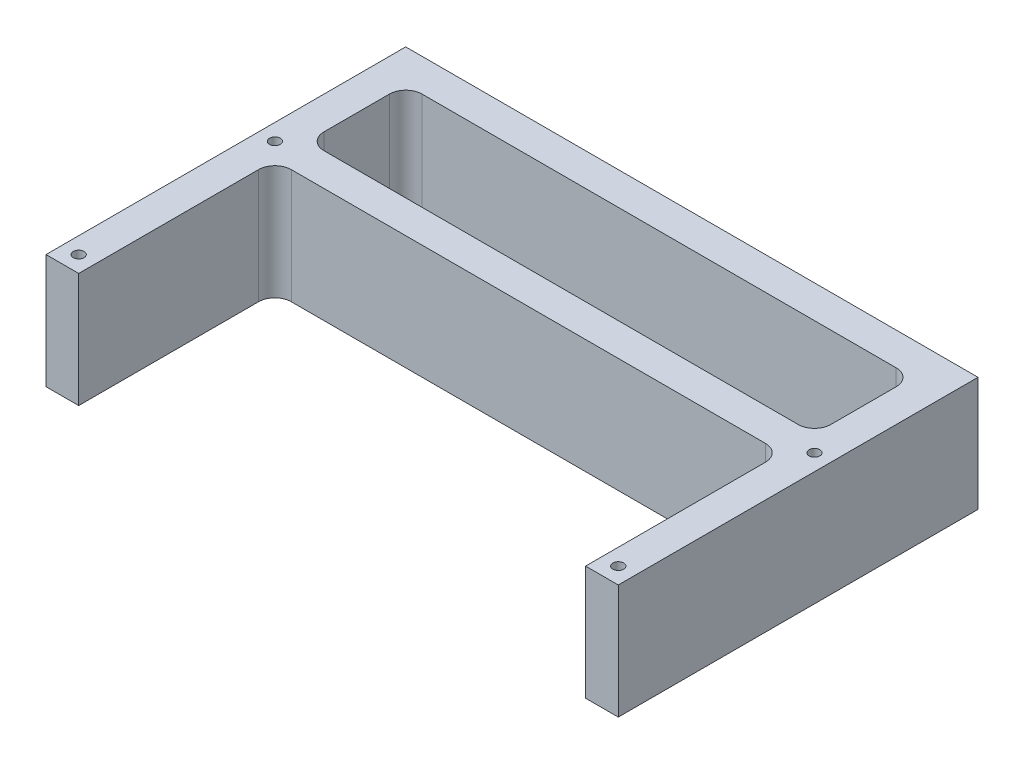
ISO-10303-21;
HEADER;
FILE_DESCRIPTION(('STEP AP214'),'2;1');
FILE_NAME('part.step','',(''),(''),'','','');
FILE_SCHEMA(('AUTOMOTIVE_DESIGN { 1 0 10303 214 1 1 1 1 }'));
ENDSEC;
DATA;
#1=APPLICATION_CONTEXT('core data for automotive mechanical design processes');
#2=APPLICATION_PROTOCOL_DEFINITION('international standard','automotive_design',2000,#1);
#3=PRODUCT_CONTEXT('',#1,'mechanical');
#4=PRODUCT('Part','Part','',(#3));
#5=PRODUCT_RELATED_PRODUCT_CATEGORY('part','',(#4));
#6=PRODUCT_DEFINITION_FORMATION('','',#4);
#7=PRODUCT_DEFINITION_CONTEXT('part definition',#1,'design');
#8=PRODUCT_DEFINITION('design','',#6,#7);
#9=PRODUCT_DEFINITION_SHAPE('','',#8);
#10=(LENGTH_UNIT() NAMED_UNIT(*) SI_UNIT(.MILLI.,.METRE.));
#11=(NAMED_UNIT(*) PLANE_ANGLE_UNIT() SI_UNIT($,.RADIAN.));
#12=(NAMED_UNIT(*) SI_UNIT($,.STERADIAN.) SOLID_ANGLE_UNIT());
#13=UNCERTAINTY_MEASURE_WITH_UNIT(LENGTH_MEASURE(1.E-05),#10,'distance_accuracy_value','');
#14=(GEOMETRIC_REPRESENTATION_CONTEXT(3) GLOBAL_UNCERTAINTY_ASSIGNED_CONTEXT((#13)) GLOBAL_UNIT_ASSIGNED_CONTEXT((#10,
#11,#12)) REPRESENTATION_CONTEXT('',''));
#15=CARTESIAN_POINT('',(0.,0.,0.));
#16=DIRECTION('',(0.,0.,1.));
#17=DIRECTION('',(1.,0.,0.));
#18=AXIS2_PLACEMENT_3D('',#15,#16,#17);
#19=CARTESIAN_POINT('',(0.,-17.5,0.));
#20=DIRECTION('',(0.,1.,0.));
#21=DIRECTION('',(0.,0.,1.));
#22=AXIS2_PLACEMENT_3D('',#19,#20,#21);
#23=PLANE('',#22);
#24=CARTESIAN_POINT('',(-82.5,-17.5,80.));
#25=DIRECTION('',(0.,-1.,0.));
#26=DIRECTION('',(0.,0.,-1.));
#27=AXIS2_PLACEMENT_3D('',#24,#25,#26);
#28=CIRCLE('',#27,1.64999999999998);
#29=CARTESIAN_POINT('',(-82.5,-17.5,78.35));
#30=VERTEX_POINT('',#29);
#31=EDGE_CURVE('E196',#30,#30,#28,.T.);
#32=ORIENTED_EDGE('',*,*,#31,.F.);
#33=EDGE_LOOP('',(#32));
#34=FACE_BOUND('',#33,.T.);
#35=DIRECTION('',(0.,0.,1.));
#36=VECTOR('',#35,1.);
#37=CARTESIAN_POINT('',(-87.5,-17.5,-25.));
#38=LINE('',#37,#36);
#39=CARTESIAN_POINT('',(-87.5,-17.5,-25.));
#40=VERTEX_POINT('',#39);
#41=CARTESIAN_POINT('',(-87.5,-17.5,85.));
#42=VERTEX_POINT('',#41);
#43=EDGE_CURVE('E268',#40,#42,#38,.T.);
#44=ORIENTED_EDGE('',*,*,#43,.F.);
#45=DIRECTION('',(-1.,0.,0.));
#46=VECTOR('',#45,1.);
#47=CARTESIAN_POINT('',(-87.5,-17.5,-25.));
#48=LINE('',#47,#46);
#49=CARTESIAN_POINT('',(87.5,-17.5,-25.));
#50=VERTEX_POINT('',#49);
#51=EDGE_CURVE('E286',#50,#40,#48,.T.);
#52=ORIENTED_EDGE('',*,*,#51,.F.);
#53=DIRECTION('',(0.,0.,-1.));
#54=VECTOR('',#53,1.);
#55=CARTESIAN_POINT('',(87.5,-17.5,25.));
#56=LINE('',#55,#54);
#57=CARTESIAN_POINT('',(87.5,-17.5,85.));
#58=VERTEX_POINT('',#57);
#59=EDGE_CURVE('E284',#58,#50,#56,.T.);
#60=ORIENTED_EDGE('',*,*,#59,.F.);
#61=DIRECTION('',(1.,0.,0.));
#62=VECTOR('',#61,1.);
#63=CARTESIAN_POINT('',(77.5,-17.5,85.));
#64=LINE('',#63,#62);
#65=CARTESIAN_POINT('',(77.5,-17.5,85.));
#66=VERTEX_POINT('',#65);
#67=EDGE_CURVE('E281',#66,#58,#64,.T.);
#68=ORIENTED_EDGE('',*,*,#67,.F.);
#69=DIRECTION('',(0.,0.,1.));
#70=VECTOR('',#69,1.);
#71=CARTESIAN_POINT('',(77.5,-17.5,25.));
#72=LINE('',#71,#70);
#73=CARTESIAN_POINT('',(77.5,-17.5,30.));
#74=VERTEX_POINT('',#73);
#75=EDGE_CURVE('E279',#74,#66,#72,.T.);
#76=ORIENTED_EDGE('',*,*,#75,.F.);
#77=CARTESIAN_POINT('',(72.5,-17.5,30.));
#78=DIRECTION('',(0.,1.,0.));
#79=DIRECTION('',(0.,0.,1.));
#80=AXIS2_PLACEMENT_3D('',#77,#78,#79);
#81=CIRCLE('',#80,5.);
#82=CARTESIAN_POINT('',(72.5,-17.5,25.));
#83=VERTEX_POINT('',#82);
#84=EDGE_CURVE('E360',#74,#83,#81,.T.);
#85=ORIENTED_EDGE('',*,*,#84,.T.);
#86=DIRECTION('',(1.,0.,0.));
#87=VECTOR('',#86,1.);
#88=CARTESIAN_POINT('',(-77.5,-17.5,25.));
#89=LINE('',#88,#87);
#90=CARTESIAN_POINT('',(-72.5,-17.5,25.));
#91=VERTEX_POINT('',#90);
#92=EDGE_CURVE('E276',#91,#83,#89,.T.);
#93=ORIENTED_EDGE('',*,*,#92,.F.);
#94=CARTESIAN_POINT('',(-72.5,-17.5,30.));
#95=DIRECTION('',(0.,1.,0.));
#96=DIRECTION('',(0.,0.,1.));
#97=AXIS2_PLACEMENT_3D('',#94,#95,#96);
#98=CIRCLE('',#97,5.);
#99=CARTESIAN_POINT('',(-77.5,-17.5,30.));
#100=VERTEX_POINT('',#99);
#101=EDGE_CURVE('E52',#91,#100,#98,.T.);
#102=ORIENTED_EDGE('',*,*,#101,.T.);
#103=DIRECTION('',(0.,0.,-1.));
#104=VECTOR('',#103,1.);
#105=CARTESIAN_POINT('',(-77.5,-17.5,25.));
#106=LINE('',#105,#104);
#107=CARTESIAN_POINT('',(-77.5,-17.5,85.));
#108=VERTEX_POINT('',#107);
#109=EDGE_CURVE('E274',#108,#100,#106,.T.);
#110=ORIENTED_EDGE('',*,*,#109,.F.);
#111=DIRECTION('',(1.,0.,0.));
#112=VECTOR('',#111,1.);
#113=CARTESIAN_POINT('',(-87.5,-17.5,85.));
#114=LINE('',#113,#112);
#115=EDGE_CURVE('E270',#42,#108,#114,.T.);
#116=ORIENTED_EDGE('',*,*,#115,.F.);
#117=EDGE_LOOP('',(#44,#52,#60,#68,#76,#85,#93,#102,#110,#116));
#118=FACE_BOUND('',#117,.T.);
#119=DIRECTION('',(0.,0.,-1.));
#120=VECTOR('',#119,1.);
#121=CARTESIAN_POINT('',(77.5,-17.5,-15.));
#122=LINE('',#121,#120);
#123=CARTESIAN_POINT('',(77.5,-17.5,10.));
#124=VERTEX_POINT('',#123);
#125=CARTESIAN_POINT('',(77.5,-17.5,-10.));
#126=VERTEX_POINT('',#125);
#127=EDGE_CURVE('E251',#124,#126,#122,.T.);
#128=ORIENTED_EDGE('',*,*,#127,.T.);
#129=CARTESIAN_POINT('',(72.5,-17.5,-10.));
#130=DIRECTION('',(0.,1.,0.));
#131=DIRECTION('',(0.,0.,1.));
#132=AXIS2_PLACEMENT_3D('',#129,#130,#131);
#133=CIRCLE('',#132,5.);
#134=CARTESIAN_POINT('',(72.5,-17.5,-15.));
#135=VERTEX_POINT('',#134);
#136=EDGE_CURVE('E364',#126,#135,#133,.T.);
#137=ORIENTED_EDGE('',*,*,#136,.T.);
#138=DIRECTION('',(-1.,0.,0.));
#139=VECTOR('',#138,1.);
#140=CARTESIAN_POINT('',(-77.5,-17.5,-15.));
#141=LINE('',#140,#139);
#142=CARTESIAN_POINT('',(-72.5,-17.5,-15.));
#143=VERTEX_POINT('',#142);
#144=EDGE_CURVE('E254',#135,#143,#141,.T.);
#145=ORIENTED_EDGE('',*,*,#144,.T.);
#146=CARTESIAN_POINT('',(-72.5,-17.5,-10.));
#147=DIRECTION('',(0.,1.,0.));
#148=DIRECTION('',(0.,0.,1.));
#149=AXIS2_PLACEMENT_3D('',#146,#147,#148);
#150=CIRCLE('',#149,5.);
#151=CARTESIAN_POINT('',(-77.5,-17.5,-10.));
#152=VERTEX_POINT('',#151);
#153=EDGE_CURVE('E11',#143,#152,#150,.T.);
#154=ORIENTED_EDGE('',*,*,#153,.T.);
#155=DIRECTION('',(0.,0.,1.));
#156=VECTOR('',#155,1.);
#157=CARTESIAN_POINT('',(-77.5,-17.5,-15.));
#158=LINE('',#157,#156);
#159=CARTESIAN_POINT('',(-77.5,-17.5,10.));
#160=VERTEX_POINT('',#159);
#161=EDGE_CURVE('E244',#152,#160,#158,.T.);
#162=ORIENTED_EDGE('',*,*,#161,.T.);
#163=CARTESIAN_POINT('',(-72.5,-17.5,10.));
#164=DIRECTION('',(0.,1.,0.));
#165=DIRECTION('',(0.,0.,1.));
#166=AXIS2_PLACEMENT_3D('',#163,#164,#165);
#167=CIRCLE('',#166,5.);
#168=CARTESIAN_POINT('',(-72.5,-17.5,15.));
#169=VERTEX_POINT('',#168);
#170=EDGE_CURVE('E368',#160,#169,#167,.T.);
#171=ORIENTED_EDGE('',*,*,#170,.T.);
#172=DIRECTION('',(1.,0.,0.));
#173=VECTOR('',#172,1.);
#174=CARTESIAN_POINT('',(-77.5,-17.5,15.));
#175=LINE('',#174,#173);
#176=CARTESIAN_POINT('',(72.5,-17.5,15.));
#177=VERTEX_POINT('',#176);
#178=EDGE_CURVE('E247',#169,#177,#175,.T.);
#179=ORIENTED_EDGE('',*,*,#178,.T.);
#180=CARTESIAN_POINT('',(72.5,-17.5,10.));
#181=DIRECTION('',(0.,1.,0.));
#182=DIRECTION('',(0.,0.,1.));
#183=AXIS2_PLACEMENT_3D('',#180,#181,#182);
#184=CIRCLE('',#183,5.);
#185=EDGE_CURVE('E356',#177,#124,#184,.T.);
#186=ORIENTED_EDGE('',*,*,#185,.T.);
#187=EDGE_LOOP('',(#128,#137,#145,#154,#162,#171,#179,#186));
#188=FACE_BOUND('',#187,.T.);
#189=CARTESIAN_POINT('',(82.5,-17.5,20.));
#190=DIRECTION('',(0.,-1.,0.));
#191=DIRECTION('',(0.,0.,-1.));
#192=AXIS2_PLACEMENT_3D('',#189,#190,#191);
#193=CIRCLE('',#192,1.64999999999998);
#194=CARTESIAN_POINT('',(82.5,-17.5,18.35));
#195=VERTEX_POINT('',#194);
#196=EDGE_CURVE('E213',#195,#195,#193,.T.);
#197=ORIENTED_EDGE('',*,*,#196,.F.);
#198=EDGE_LOOP('',(#197));
#199=FACE_BOUND('',#198,.T.);
#200=CARTESIAN_POINT('',(82.5,-17.5,80.));
#201=DIRECTION('',(0.,-1.,0.));
#202=DIRECTION('',(0.,0.,-1.));
#203=AXIS2_PLACEMENT_3D('',#200,#201,#202);
#204=CIRCLE('',#203,1.64999999999998);
#205=CARTESIAN_POINT('',(82.5,-17.5,78.35));
#206=VERTEX_POINT('',#205);
#207=EDGE_CURVE('E207',#206,#206,#204,.T.);
#208=ORIENTED_EDGE('',*,*,#207,.F.);
#209=EDGE_LOOP('',(#208));
#210=FACE_BOUND('',#209,.T.);
#211=CARTESIAN_POINT('',(-82.5,-17.5,20.));
#212=DIRECTION('',(0.,-1.,0.));
#213=DIRECTION('',(0.,0.,-1.));
#214=AXIS2_PLACEMENT_3D('',#211,#212,#213);
#215=CIRCLE('',#214,1.64999999999998);
#216=CARTESIAN_POINT('',(-82.5,-17.5,18.35));
#217=VERTEX_POINT('',#216);
#218=EDGE_CURVE('E197',#217,#217,#215,.T.);
#219=ORIENTED_EDGE('',*,*,#218,.F.);
#220=EDGE_LOOP('',(#219));
#221=FACE_BOUND('',#220,.T.);
#222=ADVANCED_FACE('F37',(#34,#118,#188,#199,#210,#221),#23,.F.);
#223=CARTESIAN_POINT('',(-87.5,-17.5,-25.));
#224=DIRECTION('',(0.,0.,-1.));
#225=DIRECTION('',(-1.,0.,0.));
#226=AXIS2_PLACEMENT_3D('',#223,#224,#225);
#227=PLANE('',#226);
#228=DIRECTION('',(-1.,0.,0.));
#229=VECTOR('',#228,1.);
#230=CARTESIAN_POINT('',(-87.5,17.5,-25.));
#231=LINE('',#230,#229);
#232=CARTESIAN_POINT('',(87.5,17.5,-25.));
#233=VERTEX_POINT('',#232);
#234=CARTESIAN_POINT('',(-87.5,17.5,-25.));
#235=VERTEX_POINT('',#234);
#236=EDGE_CURVE('E271',#233,#235,#231,.T.);
#237=ORIENTED_EDGE('',*,*,#236,.F.);
#238=DIRECTION('',(0.,1.,0.));
#239=VECTOR('',#238,1.);
#240=CARTESIAN_POINT('',(87.5,-17.5,-25.));
#241=LINE('',#240,#239);
#242=EDGE_CURVE('E315',#50,#233,#241,.T.);
#243=ORIENTED_EDGE('',*,*,#242,.F.);
#244=ORIENTED_EDGE('',*,*,#51,.T.);
#245=DIRECTION('',(0.,1.,0.));
#246=VECTOR('',#245,1.);
#247=CARTESIAN_POINT('',(-87.5,-17.5,-25.));
#248=LINE('',#247,#246);
#249=EDGE_CURVE('E311',#40,#235,#248,.T.);
#250=ORIENTED_EDGE('',*,*,#249,.T.);
#251=EDGE_LOOP('',(#237,#243,#244,#250));
#252=FACE_BOUND('',#251,.T.);
#253=ADVANCED_FACE('F423',(#252),#227,.T.);
#254=CARTESIAN_POINT('',(87.5,-17.5,-25.));
#255=DIRECTION('',(1.,0.,0.));
#256=DIRECTION('',(0.,0.,-1.));
#257=AXIS2_PLACEMENT_3D('',#254,#255,#256);
#258=PLANE('',#257);
#259=DIRECTION('',(0.,0.,-1.));
#260=VECTOR('',#259,1.);
#261=CARTESIAN_POINT('',(87.5,17.5,-25.));
#262=LINE('',#261,#260);
#263=CARTESIAN_POINT('',(87.5,17.5,85.));
#264=VERTEX_POINT('',#263);
#265=EDGE_CURVE('E306',#264,#233,#262,.T.);
#266=ORIENTED_EDGE('',*,*,#265,.F.);
#267=DIRECTION('',(0.,1.,0.));
#268=VECTOR('',#267,1.);
#269=CARTESIAN_POINT('',(87.5,-17.5,85.));
#270=LINE('',#269,#268);
#271=EDGE_CURVE('E317',#58,#264,#270,.T.);
#272=ORIENTED_EDGE('',*,*,#271,.F.);
#273=ORIENTED_EDGE('',*,*,#59,.T.);
#274=ORIENTED_EDGE('',*,*,#242,.T.);
#275=EDGE_LOOP('',(#266,#272,#273,#274));
#276=FACE_BOUND('',#275,.T.);
#277=ADVANCED_FACE('F429',(#276),#258,.T.);
#278=CARTESIAN_POINT('',(77.5,-17.5,85.));
#279=DIRECTION('',(0.,0.,1.));
#280=DIRECTION('',(1.,0.,0.));
#281=AXIS2_PLACEMENT_3D('',#278,#279,#280);
#282=PLANE('',#281);
#283=DIRECTION('',(1.,0.,0.));
#284=VECTOR('',#283,1.);
#285=CARTESIAN_POINT('',(77.5,17.5,85.));
#286=LINE('',#285,#284);
#287=CARTESIAN_POINT('',(77.5,17.5,85.));
#288=VERTEX_POINT('',#287);
#289=EDGE_CURVE('E303',#288,#264,#286,.T.);
#290=ORIENTED_EDGE('',*,*,#289,.F.);
#291=DIRECTION('',(0.,1.,0.));
#292=VECTOR('',#291,1.);
#293=CARTESIAN_POINT('',(77.5,-17.5,85.));
#294=LINE('',#293,#292);
#295=EDGE_CURVE('E320',#66,#288,#294,.T.);
#296=ORIENTED_EDGE('',*,*,#295,.F.);
#297=ORIENTED_EDGE('',*,*,#67,.T.);
#298=ORIENTED_EDGE('',*,*,#271,.T.);
#299=EDGE_LOOP('',(#290,#296,#297,#298));
#300=FACE_BOUND('',#299,.T.);
#301=ADVANCED_FACE('F442',(#300),#282,.T.);
#302=CARTESIAN_POINT('',(77.5,-17.5,25.));
#303=DIRECTION('',(-1.,0.,0.));
#304=DIRECTION('',(0.,0.,1.));
#305=AXIS2_PLACEMENT_3D('',#302,#303,#304);
#306=PLANE('',#305);
#307=DIRECTION('',(0.,0.,1.));
#308=VECTOR('',#307,1.);
#309=CARTESIAN_POINT('',(77.5,17.5,25.));
#310=LINE('',#309,#308);
#311=CARTESIAN_POINT('',(77.5,17.5,30.));
#312=VERTEX_POINT('',#311);
#313=EDGE_CURVE('E301',#312,#288,#310,.T.);
#314=ORIENTED_EDGE('',*,*,#313,.F.);
#315=DIRECTION('',(0.,1.,0.));
#316=VECTOR('',#315,1.);
#317=CARTESIAN_POINT('',(77.5,-17.5,30.));
#318=LINE('',#317,#316);
#319=EDGE_CURVE('E340',#312,#74,#318,.F.);
#320=ORIENTED_EDGE('',*,*,#319,.T.);
#321=ORIENTED_EDGE('',*,*,#75,.T.);
#322=ORIENTED_EDGE('',*,*,#295,.T.);
#323=EDGE_LOOP('',(#314,#320,#321,#322));
#324=FACE_BOUND('',#323,.T.);
#325=ADVANCED_FACE('F446',(#324),#306,.T.);
#326=CARTESIAN_POINT('',(-77.5,-17.5,25.));
#327=DIRECTION('',(0.,0.,1.));
#328=DIRECTION('',(1.,0.,0.));
#329=AXIS2_PLACEMENT_3D('',#326,#327,#328);
#330=PLANE('',#329);
#331=ORIENTED_EDGE('',*,*,#92,.T.);
#332=DIRECTION('',(0.,1.,0.));
#333=VECTOR('',#332,1.);
#334=CARTESIAN_POINT('',(72.5,17.5,25.));
#335=LINE('',#334,#333);
#336=CARTESIAN_POINT('',(72.5,17.5,25.));
#337=VERTEX_POINT('',#336);
#338=EDGE_CURVE('E337',#83,#337,#335,.T.);
#339=ORIENTED_EDGE('',*,*,#338,.T.);
#340=DIRECTION('',(1.,0.,0.));
#341=VECTOR('',#340,1.);
#342=CARTESIAN_POINT('',(-77.5,17.5,25.));
#343=LINE('',#342,#341);
#344=CARTESIAN_POINT('',(-72.5,17.5,25.));
#345=VERTEX_POINT('',#344);
#346=EDGE_CURVE('E298',#345,#337,#343,.T.);
#347=ORIENTED_EDGE('',*,*,#346,.F.);
#348=DIRECTION('',(0.,1.,0.));
#349=VECTOR('',#348,1.);
#350=CARTESIAN_POINT('',(-72.5,-17.5,25.));
#351=LINE('',#350,#349);
#352=EDGE_CURVE('E335',#345,#91,#351,.F.);
#353=ORIENTED_EDGE('',*,*,#352,.T.);
#354=EDGE_LOOP('',(#331,#339,#347,#353));
#355=FACE_BOUND('',#354,.T.);
#356=ADVANCED_FACE('F450',(#355),#330,.T.);
#357=CARTESIAN_POINT('',(-77.5,-17.5,25.));
#358=DIRECTION('',(1.,0.,0.));
#359=DIRECTION('',(0.,0.,-1.));
#360=AXIS2_PLACEMENT_3D('',#357,#358,#359);
#361=PLANE('',#360);
#362=ORIENTED_EDGE('',*,*,#109,.T.);
#363=DIRECTION('',(0.,1.,0.));
#364=VECTOR('',#363,1.);
#365=CARTESIAN_POINT('',(-77.5,17.5,30.));
#366=LINE('',#365,#364);
#367=CARTESIAN_POINT('',(-77.5,17.5,30.));
#368=VERTEX_POINT('',#367);
#369=EDGE_CURVE('E352',#100,#368,#366,.T.);
#370=ORIENTED_EDGE('',*,*,#369,.T.);
#371=DIRECTION('',(0.,0.,-1.));
#372=VECTOR('',#371,1.);
#373=CARTESIAN_POINT('',(-77.5,17.5,25.));
#374=LINE('',#373,#372);
#375=CARTESIAN_POINT('',(-77.5,17.5,85.));
#376=VERTEX_POINT('',#375);
#377=EDGE_CURVE('E295',#376,#368,#374,.T.);
#378=ORIENTED_EDGE('',*,*,#377,.F.);
#379=DIRECTION('',(0.,1.,0.));
#380=VECTOR('',#379,1.);
#381=CARTESIAN_POINT('',(-77.5,-17.5,85.));
#382=LINE('',#381,#380);
#383=EDGE_CURVE('E323',#108,#376,#382,.T.);
#384=ORIENTED_EDGE('',*,*,#383,.F.);
#385=EDGE_LOOP('',(#362,#370,#378,#384));
#386=FACE_BOUND('',#385,.T.);
#387=ADVANCED_FACE('F454',(#386),#361,.T.);
#388=CARTESIAN_POINT('',(-87.5,-17.5,85.));
#389=DIRECTION('',(0.,0.,1.));
#390=DIRECTION('',(1.,0.,0.));
#391=AXIS2_PLACEMENT_3D('',#388,#389,#390);
#392=PLANE('',#391);
#393=DIRECTION('',(1.,0.,0.));
#394=VECTOR('',#393,1.);
#395=CARTESIAN_POINT('',(-87.5,17.5,85.));
#396=LINE('',#395,#394);
#397=CARTESIAN_POINT('',(-87.5,17.5,85.));
#398=VERTEX_POINT('',#397);
#399=EDGE_CURVE('E292',#398,#376,#396,.T.);
#400=ORIENTED_EDGE('',*,*,#399,.F.);
#401=DIRECTION('',(0.,1.,0.));
#402=VECTOR('',#401,1.);
#403=CARTESIAN_POINT('',(-87.5,-17.5,85.));
#404=LINE('',#403,#402);
#405=EDGE_CURVE('E289',#42,#398,#404,.T.);
#406=ORIENTED_EDGE('',*,*,#405,.F.);
#407=ORIENTED_EDGE('',*,*,#115,.T.);
#408=ORIENTED_EDGE('',*,*,#383,.T.);
#409=EDGE_LOOP('',(#400,#406,#407,#408));
#410=FACE_BOUND('',#409,.T.);
#411=ADVANCED_FACE('F458',(#410),#392,.T.);
#412=CARTESIAN_POINT('',(-87.5,-17.5,25.));
#413=DIRECTION('',(-1.,0.,0.));
#414=DIRECTION('',(0.,0.,1.));
#415=AXIS2_PLACEMENT_3D('',#412,#413,#414);
#416=PLANE('',#415);
#417=DIRECTION('',(0.,0.,1.));
#418=VECTOR('',#417,1.);
#419=CARTESIAN_POINT('',(-87.5,17.5,25.));
#420=LINE('',#419,#418);
#421=EDGE_CURVE('E257',#235,#398,#420,.T.);
#422=ORIENTED_EDGE('',*,*,#421,.F.);
#423=ORIENTED_EDGE('',*,*,#249,.F.);
#424=ORIENTED_EDGE('',*,*,#43,.T.);
#425=ORIENTED_EDGE('',*,*,#405,.T.);
#426=EDGE_LOOP('',(#422,#423,#424,#425));
#427=FACE_BOUND('',#426,.T.);
#428=ADVANCED_FACE('F437',(#427),#416,.T.);
#429=CARTESIAN_POINT('',(0.,17.5,0.));
#430=DIRECTION('',(0.,1.,0.));
#431=DIRECTION('',(0.,0.,1.));
#432=AXIS2_PLACEMENT_3D('',#429,#430,#431);
#433=PLANE('',#432);
#434=CARTESIAN_POINT('',(-82.5,17.5,20.));
#435=DIRECTION('',(0.,1.,0.));
#436=DIRECTION('',(0.,0.,1.));
#437=AXIS2_PLACEMENT_3D('',#434,#435,#436);
#438=CIRCLE('',#437,1.64999999999998);
#439=CARTESIAN_POINT('',(-82.5,17.5,21.65));
#440=VERTEX_POINT('',#439);
#441=EDGE_CURVE('E219',#440,#440,#438,.T.);
#442=ORIENTED_EDGE('',*,*,#441,.F.);
#443=EDGE_LOOP('',(#442));
#444=FACE_BOUND('',#443,.T.);
#445=CARTESIAN_POINT('',(-82.5,17.5,80.));
#446=DIRECTION('',(0.,1.,0.));
#447=DIRECTION('',(0.,0.,1.));
#448=AXIS2_PLACEMENT_3D('',#445,#446,#447);
#449=CIRCLE('',#448,1.64999999999998);
#450=CARTESIAN_POINT('',(-82.5,17.5,81.65));
#451=VERTEX_POINT('',#450);
#452=EDGE_CURVE('E225',#451,#451,#449,.T.);
#453=ORIENTED_EDGE('',*,*,#452,.F.);
#454=EDGE_LOOP('',(#453));
#455=FACE_BOUND('',#454,.T.);
#456=CARTESIAN_POINT('',(82.5,17.5,80.));
#457=DIRECTION('',(0.,1.,0.));
#458=DIRECTION('',(0.,0.,1.));
#459=AXIS2_PLACEMENT_3D('',#456,#457,#458);
#460=CIRCLE('',#459,1.64999999999998);
#461=CARTESIAN_POINT('',(82.5,17.5,81.65));
#462=VERTEX_POINT('',#461);
#463=EDGE_CURVE('E231',#462,#462,#460,.T.);
#464=ORIENTED_EDGE('',*,*,#463,.F.);
#465=EDGE_LOOP('',(#464));
#466=FACE_BOUND('',#465,.T.);
#467=CARTESIAN_POINT('',(82.5,17.5,20.));
#468=DIRECTION('',(0.,1.,0.));
#469=DIRECTION('',(0.,0.,1.));
#470=AXIS2_PLACEMENT_3D('',#467,#468,#469);
#471=CIRCLE('',#470,1.64999999999998);
#472=CARTESIAN_POINT('',(82.5,17.5,21.65));
#473=VERTEX_POINT('',#472);
#474=EDGE_CURVE('E237',#473,#473,#471,.T.);
#475=ORIENTED_EDGE('',*,*,#474,.F.);
#476=EDGE_LOOP('',(#475));
#477=FACE_BOUND('',#476,.T.);
#478=DIRECTION('',(0.,0.,1.));
#479=VECTOR('',#478,1.);
#480=CARTESIAN_POINT('',(-77.5,17.5,-15.));
#481=LINE('',#480,#479);
#482=CARTESIAN_POINT('',(-77.5,17.5,-10.));
#483=VERTEX_POINT('',#482);
#484=CARTESIAN_POINT('',(-77.5,17.5,10.));
#485=VERTEX_POINT('',#484);
#486=EDGE_CURVE('E243',#483,#485,#481,.T.);
#487=ORIENTED_EDGE('',*,*,#486,.F.);
#488=CARTESIAN_POINT('',(-72.5,17.5,-10.));
#489=DIRECTION('',(0.,1.,0.));
#490=DIRECTION('',(0.,0.,1.));
#491=AXIS2_PLACEMENT_3D('',#488,#489,#490);
#492=CIRCLE('',#491,5.);
#493=CARTESIAN_POINT('',(-72.5,17.5,-15.));
#494=VERTEX_POINT('',#493);
#495=EDGE_CURVE('E45',#483,#494,#492,.F.);
#496=ORIENTED_EDGE('',*,*,#495,.T.);
#497=DIRECTION('',(-1.,0.,0.));
#498=VECTOR('',#497,1.);
#499=CARTESIAN_POINT('',(-77.5,17.5,-15.));
#500=LINE('',#499,#498);
#501=CARTESIAN_POINT('',(72.5,17.5,-15.));
#502=VERTEX_POINT('',#501);
#503=EDGE_CURVE('E248',#502,#494,#500,.T.);
#504=ORIENTED_EDGE('',*,*,#503,.F.);
#505=CARTESIAN_POINT('',(72.5,17.5,-10.));
#506=DIRECTION('',(0.,1.,0.));
#507=DIRECTION('',(0.,0.,1.));
#508=AXIS2_PLACEMENT_3D('',#505,#506,#507);
#509=CIRCLE('',#508,5.);
#510=CARTESIAN_POINT('',(77.5,17.5,-10.));
#511=VERTEX_POINT('',#510);
#512=EDGE_CURVE('E362',#502,#511,#509,.F.);
#513=ORIENTED_EDGE('',*,*,#512,.T.);
#514=DIRECTION('',(0.,0.,-1.));
#515=VECTOR('',#514,1.);
#516=CARTESIAN_POINT('',(77.5,17.5,-15.));
#517=LINE('',#516,#515);
#518=CARTESIAN_POINT('',(77.5,17.5,10.));
#519=VERTEX_POINT('',#518);
#520=EDGE_CURVE('E263',#519,#511,#517,.T.);
#521=ORIENTED_EDGE('',*,*,#520,.F.);
#522=CARTESIAN_POINT('',(72.5,17.5,10.));
#523=DIRECTION('',(0.,1.,0.));
#524=DIRECTION('',(0.,0.,1.));
#525=AXIS2_PLACEMENT_3D('',#522,#523,#524);
#526=CIRCLE('',#525,5.);
#527=CARTESIAN_POINT('',(72.5,17.5,15.));
#528=VERTEX_POINT('',#527);
#529=EDGE_CURVE('E354',#519,#528,#526,.F.);
#530=ORIENTED_EDGE('',*,*,#529,.T.);
#531=DIRECTION('',(1.,0.,0.));
#532=VECTOR('',#531,1.);
#533=CARTESIAN_POINT('',(-77.5,17.5,15.));
#534=LINE('',#533,#532);
#535=CARTESIAN_POINT('',(-72.5,17.5,15.));
#536=VERTEX_POINT('',#535);
#537=EDGE_CURVE('E260',#536,#528,#534,.T.);
#538=ORIENTED_EDGE('',*,*,#537,.F.);
#539=CARTESIAN_POINT('',(-72.5,17.5,10.));
#540=DIRECTION('',(0.,1.,0.));
#541=DIRECTION('',(0.,0.,1.));
#542=AXIS2_PLACEMENT_3D('',#539,#540,#541);
#543=CIRCLE('',#542,5.);
#544=EDGE_CURVE('E366',#536,#485,#543,.F.);
#545=ORIENTED_EDGE('',*,*,#544,.T.);
#546=EDGE_LOOP('',(#487,#496,#504,#513,#521,#530,#538,#545));
#547=FACE_BOUND('',#546,.T.);
#548=ORIENTED_EDGE('',*,*,#236,.T.);
#549=ORIENTED_EDGE('',*,*,#421,.T.);
#550=ORIENTED_EDGE('',*,*,#399,.T.);
#551=ORIENTED_EDGE('',*,*,#377,.T.);
#552=CARTESIAN_POINT('',(-72.5,17.5,30.));
#553=DIRECTION('',(0.,1.,0.));
#554=DIRECTION('',(0.,0.,1.));
#555=AXIS2_PLACEMENT_3D('',#552,#553,#554);
#556=CIRCLE('',#555,5.);
#557=EDGE_CURVE('E60',#368,#345,#556,.F.);
#558=ORIENTED_EDGE('',*,*,#557,.T.);
#559=ORIENTED_EDGE('',*,*,#346,.T.);
#560=CARTESIAN_POINT('',(72.5,17.5,30.));
#561=DIRECTION('',(0.,1.,0.));
#562=DIRECTION('',(0.,0.,1.));
#563=AXIS2_PLACEMENT_3D('',#560,#561,#562);
#564=CIRCLE('',#563,5.);
#565=EDGE_CURVE('E358',#337,#312,#564,.F.);
#566=ORIENTED_EDGE('',*,*,#565,.T.);
#567=ORIENTED_EDGE('',*,*,#313,.T.);
#568=ORIENTED_EDGE('',*,*,#289,.T.);
#569=ORIENTED_EDGE('',*,*,#265,.T.);
#570=EDGE_LOOP('',(#548,#549,#550,#551,#558,#559,#566,#567,#568,#569));
#571=FACE_BOUND('',#570,.T.);
#572=ADVANCED_FACE('F374',(#444,#455,#466,#477,#547,#571),#433,.T.);
#573=CARTESIAN_POINT('',(-77.5,-17.5,-15.));
#574=DIRECTION('',(-1.,0.,0.));
#575=DIRECTION('',(0.,0.,1.));
#576=AXIS2_PLACEMENT_3D('',#573,#574,#575);
#577=PLANE('',#576);
#578=ORIENTED_EDGE('',*,*,#486,.T.);
#579=DIRECTION('',(0.,1.,0.));
#580=VECTOR('',#579,1.);
#581=CARTESIAN_POINT('',(-77.5,-17.5,10.));
#582=LINE('',#581,#580);
#583=EDGE_CURVE('E350',#485,#160,#582,.F.);
#584=ORIENTED_EDGE('',*,*,#583,.T.);
#585=ORIENTED_EDGE('',*,*,#161,.F.);
#586=DIRECTION('',(0.,1.,0.));
#587=VECTOR('',#586,1.);
#588=CARTESIAN_POINT('',(-77.5,17.5,-10.));
#589=LINE('',#588,#587);
#590=EDGE_CURVE('E347',#152,#483,#589,.T.);
#591=ORIENTED_EDGE('',*,*,#590,.T.);
#592=EDGE_LOOP('',(#578,#584,#585,#591));
#593=FACE_BOUND('',#592,.T.);
#594=ADVANCED_FACE('F389',(#593),#577,.F.);
#595=CARTESIAN_POINT('',(-77.5,-17.5,-15.));
#596=DIRECTION('',(0.,0.,-1.));
#597=DIRECTION('',(-1.,0.,0.));
#598=AXIS2_PLACEMENT_3D('',#595,#596,#597);
#599=PLANE('',#598);
#600=ORIENTED_EDGE('',*,*,#144,.F.);
#601=DIRECTION('',(0.,1.,0.));
#602=VECTOR('',#601,1.);
#603=CARTESIAN_POINT('',(72.5,17.5,-15.));
#604=LINE('',#603,#602);
#605=EDGE_CURVE('E344',#135,#502,#604,.T.);
#606=ORIENTED_EDGE('',*,*,#605,.T.);
#607=ORIENTED_EDGE('',*,*,#503,.T.);
#608=DIRECTION('',(0.,1.,0.));
#609=VECTOR('',#608,1.);
#610=CARTESIAN_POINT('',(-72.5,-17.5,-15.));
#611=LINE('',#610,#609);
#612=EDGE_CURVE('E342',#494,#143,#611,.F.);
#613=ORIENTED_EDGE('',*,*,#612,.T.);
#614=EDGE_LOOP('',(#600,#606,#607,#613));
#615=FACE_BOUND('',#614,.T.);
#616=ADVANCED_FACE('F381',(#615),#599,.F.);
#617=CARTESIAN_POINT('',(77.5,-17.5,-15.));
#618=DIRECTION('',(1.,0.,0.));
#619=DIRECTION('',(0.,0.,-1.));
#620=AXIS2_PLACEMENT_3D('',#617,#618,#619);
#621=PLANE('',#620);
#622=ORIENTED_EDGE('',*,*,#127,.F.);
#623=DIRECTION('',(0.,1.,0.));
#624=VECTOR('',#623,1.);
#625=CARTESIAN_POINT('',(77.5,17.5,10.));
#626=LINE('',#625,#624);
#627=EDGE_CURVE('E327',#124,#519,#626,.T.);
#628=ORIENTED_EDGE('',*,*,#627,.T.);
#629=ORIENTED_EDGE('',*,*,#520,.T.);
#630=DIRECTION('',(0.,1.,0.));
#631=VECTOR('',#630,1.);
#632=CARTESIAN_POINT('',(77.5,-17.5,-10.));
#633=LINE('',#632,#631);
#634=EDGE_CURVE('E314',#511,#126,#633,.F.);
#635=ORIENTED_EDGE('',*,*,#634,.T.);
#636=EDGE_LOOP('',(#622,#628,#629,#635));
#637=FACE_BOUND('',#636,.T.);
#638=ADVANCED_FACE('F406',(#637),#621,.F.);
#639=CARTESIAN_POINT('',(-77.5,-17.5,15.));
#640=DIRECTION('',(0.,0.,1.));
#641=DIRECTION('',(1.,0.,0.));
#642=AXIS2_PLACEMENT_3D('',#639,#640,#641);
#643=PLANE('',#642);
#644=ORIENTED_EDGE('',*,*,#537,.T.);
#645=DIRECTION('',(0.,1.,0.));
#646=VECTOR('',#645,1.);
#647=CARTESIAN_POINT('',(72.5,-17.5,15.));
#648=LINE('',#647,#646);
#649=EDGE_CURVE('E333',#528,#177,#648,.F.);
#650=ORIENTED_EDGE('',*,*,#649,.T.);
#651=ORIENTED_EDGE('',*,*,#178,.F.);
#652=DIRECTION('',(0.,1.,0.));
#653=VECTOR('',#652,1.);
#654=CARTESIAN_POINT('',(-72.5,17.5,15.));
#655=LINE('',#654,#653);
#656=EDGE_CURVE('E330',#169,#536,#655,.T.);
#657=ORIENTED_EDGE('',*,*,#656,.T.);
#658=EDGE_LOOP('',(#644,#650,#651,#657));
#659=FACE_BOUND('',#658,.T.);
#660=ADVANCED_FACE('F397',(#659),#643,.F.);
#661=CARTESIAN_POINT('',(72.5,-17.5,10.));
#662=DIRECTION('',(0.,-1.,0.));
#663=DIRECTION('',(0.,0.,-1.));
#664=AXIS2_PLACEMENT_3D('',#661,#662,#663);
#665=CYLINDRICAL_SURFACE('',#664,5.);
#666=ORIENTED_EDGE('',*,*,#185,.F.);
#667=ORIENTED_EDGE('',*,*,#649,.F.);
#668=ORIENTED_EDGE('',*,*,#529,.F.);
#669=ORIENTED_EDGE('',*,*,#627,.F.);
#670=EDGE_LOOP('',(#666,#667,#668,#669));
#671=FACE_BOUND('',#670,.T.);
#672=ADVANCED_FACE('F401',(#671),#665,.F.);
#673=CARTESIAN_POINT('',(72.5,-17.5,30.));
#674=DIRECTION('',(0.,-1.,0.));
#675=DIRECTION('',(0.,0.,-1.));
#676=AXIS2_PLACEMENT_3D('',#673,#674,#675);
#677=CYLINDRICAL_SURFACE('',#676,5.);
#678=ORIENTED_EDGE('',*,*,#84,.F.);
#679=ORIENTED_EDGE('',*,*,#319,.F.);
#680=ORIENTED_EDGE('',*,*,#565,.F.);
#681=ORIENTED_EDGE('',*,*,#338,.F.);
#682=EDGE_LOOP('',(#678,#679,#680,#681));
#683=FACE_BOUND('',#682,.T.);
#684=ADVANCED_FACE('F412',(#683),#677,.F.);
#685=CARTESIAN_POINT('',(72.5,-17.5,-10.));
#686=DIRECTION('',(0.,-1.,0.));
#687=DIRECTION('',(0.,0.,-1.));
#688=AXIS2_PLACEMENT_3D('',#685,#686,#687);
#689=CYLINDRICAL_SURFACE('',#688,5.);
#690=ORIENTED_EDGE('',*,*,#136,.F.);
#691=ORIENTED_EDGE('',*,*,#634,.F.);
#692=ORIENTED_EDGE('',*,*,#512,.F.);
#693=ORIENTED_EDGE('',*,*,#605,.F.);
#694=EDGE_LOOP('',(#690,#691,#692,#693));
#695=FACE_BOUND('',#694,.T.);
#696=ADVANCED_FACE('F410',(#695),#689,.F.);
#697=CARTESIAN_POINT('',(-72.5,-17.5,10.));
#698=DIRECTION('',(0.,-1.,0.));
#699=DIRECTION('',(0.,0.,-1.));
#700=AXIS2_PLACEMENT_3D('',#697,#698,#699);
#701=CYLINDRICAL_SURFACE('',#700,5.);
#702=ORIENTED_EDGE('',*,*,#170,.F.);
#703=ORIENTED_EDGE('',*,*,#583,.F.);
#704=ORIENTED_EDGE('',*,*,#544,.F.);
#705=ORIENTED_EDGE('',*,*,#656,.F.);
#706=EDGE_LOOP('',(#702,#703,#704,#705));
#707=FACE_BOUND('',#706,.T.);
#708=ADVANCED_FACE('F392',(#707),#701,.F.);
#709=CARTESIAN_POINT('',(-72.5,-17.5,30.));
#710=DIRECTION('',(0.,-1.,0.));
#711=DIRECTION('',(0.,0.,-1.));
#712=AXIS2_PLACEMENT_3D('',#709,#710,#711);
#713=CYLINDRICAL_SURFACE('',#712,5.);
#714=ORIENTED_EDGE('',*,*,#101,.F.);
#715=ORIENTED_EDGE('',*,*,#352,.F.);
#716=ORIENTED_EDGE('',*,*,#557,.F.);
#717=ORIENTED_EDGE('',*,*,#369,.F.);
#718=EDGE_LOOP('',(#714,#715,#716,#717));
#719=FACE_BOUND('',#718,.T.);
#720=ADVANCED_FACE('F418',(#719),#713,.F.);
#721=CARTESIAN_POINT('',(-72.5,-17.5,-10.));
#722=DIRECTION('',(0.,-1.,0.));
#723=DIRECTION('',(0.,0.,-1.));
#724=AXIS2_PLACEMENT_3D('',#721,#722,#723);
#725=CYLINDRICAL_SURFACE('',#724,5.);
#726=ORIENTED_EDGE('',*,*,#153,.F.);
#727=ORIENTED_EDGE('',*,*,#612,.F.);
#728=ORIENTED_EDGE('',*,*,#495,.F.);
#729=ORIENTED_EDGE('',*,*,#590,.F.);
#730=EDGE_LOOP('',(#726,#727,#728,#729));
#731=FACE_BOUND('',#730,.T.);
#732=ADVANCED_FACE('F39',(#731),#725,.F.);
#733=CARTESIAN_POINT('',(82.5,1.5,20.));
#734=DIRECTION('',(0.,1.,0.));
#735=DIRECTION('',(0.,0.,1.));
#736=AXIS2_PLACEMENT_3D('',#733,#734,#735);
#737=CONICAL_SURFACE('',#736,1.64999999999998,1.02974425867665);
#738=CARTESIAN_POINT('',(82.5,0.508579978604526,20.));
#739=VERTEX_POINT('',#738);
#740=VERTEX_LOOP('',#739);
#741=FACE_BOUND('',#740,.T.);
#742=CARTESIAN_POINT('',(82.5,1.5,20.));
#743=DIRECTION('',(0.,1.,0.));
#744=DIRECTION('',(0.,0.,1.));
#745=AXIS2_PLACEMENT_3D('',#742,#743,#744);
#746=CIRCLE('',#745,1.64999999999998);
#747=CARTESIAN_POINT('',(82.5,1.5,21.65));
#748=VERTEX_POINT('',#747);
#749=EDGE_CURVE('E240',#748,#748,#746,.T.);
#750=ORIENTED_EDGE('',*,*,#749,.T.);
#751=EDGE_LOOP('',(#750));
#752=FACE_BOUND('',#751,.T.);
#753=ADVANCED_FACE('F477',(#741,#752),#737,.F.);
#754=CARTESIAN_POINT('',(82.5,17.5,20.));
#755=DIRECTION('',(0.,1.,0.));
#756=DIRECTION('',(0.,0.,1.));
#757=AXIS2_PLACEMENT_3D('',#754,#755,#756);
#758=CYLINDRICAL_SURFACE('',#757,1.64999999999998);
#759=ORIENTED_EDGE('',*,*,#749,.F.);
#760=EDGE_LOOP('',(#759));
#761=FACE_BOUND('',#760,.T.);
#762=ORIENTED_EDGE('',*,*,#474,.T.);
#763=EDGE_LOOP('',(#762));
#764=FACE_BOUND('',#763,.T.);
#765=ADVANCED_FACE('F480',(#761,#764),#758,.F.);
#766=CARTESIAN_POINT('',(82.5,1.5,80.));
#767=DIRECTION('',(0.,1.,0.));
#768=DIRECTION('',(0.,0.,1.));
#769=AXIS2_PLACEMENT_3D('',#766,#767,#768);
#770=CONICAL_SURFACE('',#769,1.64999999999998,1.02974425867665);
#771=CARTESIAN_POINT('',(82.5,0.508579978604526,80.));
#772=VERTEX_POINT('',#771);
#773=VERTEX_LOOP('',#772);
#774=FACE_BOUND('',#773,.T.);
#775=CARTESIAN_POINT('',(82.5,1.5,80.));
#776=DIRECTION('',(0.,1.,0.));
#777=DIRECTION('',(0.,0.,1.));
#778=AXIS2_PLACEMENT_3D('',#775,#776,#777);
#779=CIRCLE('',#778,1.64999999999998);
#780=CARTESIAN_POINT('',(82.5,1.5,81.65));
#781=VERTEX_POINT('',#780);
#782=EDGE_CURVE('E234',#781,#781,#779,.T.);
#783=ORIENTED_EDGE('',*,*,#782,.T.);
#784=EDGE_LOOP('',(#783));
#785=FACE_BOUND('',#784,.T.);
#786=ADVANCED_FACE('F484',(#774,#785),#770,.F.);
#787=CARTESIAN_POINT('',(82.5,17.5,80.));
#788=DIRECTION('',(0.,1.,0.));
#789=DIRECTION('',(0.,0.,1.));
#790=AXIS2_PLACEMENT_3D('',#787,#788,#789);
#791=CYLINDRICAL_SURFACE('',#790,1.64999999999998);
#792=ORIENTED_EDGE('',*,*,#782,.F.);
#793=EDGE_LOOP('',(#792));
#794=FACE_BOUND('',#793,.T.);
#795=ORIENTED_EDGE('',*,*,#463,.T.);
#796=EDGE_LOOP('',(#795));
#797=FACE_BOUND('',#796,.T.);
#798=ADVANCED_FACE('F488',(#794,#797),#791,.F.);
#799=CARTESIAN_POINT('',(-82.5,1.5,80.));
#800=DIRECTION('',(0.,1.,0.));
#801=DIRECTION('',(0.,0.,1.));
#802=AXIS2_PLACEMENT_3D('',#799,#800,#801);
#803=CONICAL_SURFACE('',#802,1.64999999999998,1.02974425867665);
#804=CARTESIAN_POINT('',(-82.5,0.508579978604526,80.));
#805=VERTEX_POINT('',#804);
#806=VERTEX_LOOP('',#805);
#807=FACE_BOUND('',#806,.T.);
#808=CARTESIAN_POINT('',(-82.5,1.5,80.));
#809=DIRECTION('',(0.,1.,0.));
#810=DIRECTION('',(0.,0.,1.));
#811=AXIS2_PLACEMENT_3D('',#808,#809,#810);
#812=CIRCLE('',#811,1.64999999999998);
#813=CARTESIAN_POINT('',(-82.5,1.5,81.65));
#814=VERTEX_POINT('',#813);
#815=EDGE_CURVE('E228',#814,#814,#812,.T.);
#816=ORIENTED_EDGE('',*,*,#815,.T.);
#817=EDGE_LOOP('',(#816));
#818=FACE_BOUND('',#817,.T.);
#819=ADVANCED_FACE('F492',(#807,#818),#803,.F.);
#820=CARTESIAN_POINT('',(-82.5,17.5,80.));
#821=DIRECTION('',(0.,1.,0.));
#822=DIRECTION('',(0.,0.,1.));
#823=AXIS2_PLACEMENT_3D('',#820,#821,#822);
#824=CYLINDRICAL_SURFACE('',#823,1.64999999999998);
#825=ORIENTED_EDGE('',*,*,#815,.F.);
#826=EDGE_LOOP('',(#825));
#827=FACE_BOUND('',#826,.T.);
#828=ORIENTED_EDGE('',*,*,#452,.T.);
#829=EDGE_LOOP('',(#828));
#830=FACE_BOUND('',#829,.T.);
#831=ADVANCED_FACE('F496',(#827,#830),#824,.F.);
#832=CARTESIAN_POINT('',(-82.5,1.5,20.));
#833=DIRECTION('',(0.,1.,0.));
#834=DIRECTION('',(0.,0.,1.));
#835=AXIS2_PLACEMENT_3D('',#832,#833,#834);
#836=CONICAL_SURFACE('',#835,1.64999999999998,1.02974425867665);
#837=CARTESIAN_POINT('',(-82.5,0.508579978604526,20.));
#838=VERTEX_POINT('',#837);
#839=VERTEX_LOOP('',#838);
#840=FACE_BOUND('',#839,.T.);
#841=CARTESIAN_POINT('',(-82.5,1.5,20.));
#842=DIRECTION('',(0.,1.,0.));
#843=DIRECTION('',(0.,0.,1.));
#844=AXIS2_PLACEMENT_3D('',#841,#842,#843);
#845=CIRCLE('',#844,1.64999999999998);
#846=CARTESIAN_POINT('',(-82.5,1.5,21.65));
#847=VERTEX_POINT('',#846);
#848=EDGE_CURVE('E222',#847,#847,#845,.T.);
#849=ORIENTED_EDGE('',*,*,#848,.T.);
#850=EDGE_LOOP('',(#849));
#851=FACE_BOUND('',#850,.T.);
#852=ADVANCED_FACE('F500',(#840,#851),#836,.F.);
#853=CARTESIAN_POINT('',(-82.5,17.5,20.));
#854=DIRECTION('',(0.,1.,0.));
#855=DIRECTION('',(0.,0.,1.));
#856=AXIS2_PLACEMENT_3D('',#853,#854,#855);
#857=CYLINDRICAL_SURFACE('',#856,1.64999999999998);
#858=ORIENTED_EDGE('',*,*,#848,.F.);
#859=EDGE_LOOP('',(#858));
#860=FACE_BOUND('',#859,.T.);
#861=ORIENTED_EDGE('',*,*,#441,.T.);
#862=EDGE_LOOP('',(#861));
#863=FACE_BOUND('',#862,.T.);
#864=ADVANCED_FACE('F504',(#860,#863),#857,.F.);
#865=CARTESIAN_POINT('',(82.5,-1.5,20.));
#866=DIRECTION('',(0.,-1.,0.));
#867=DIRECTION('',(0.,0.,-1.));
#868=AXIS2_PLACEMENT_3D('',#865,#866,#867);
#869=CONICAL_SURFACE('',#868,1.64999999999998,1.02974425867665);
#870=CARTESIAN_POINT('',(82.5,-0.508579978604526,20.));
#871=VERTEX_POINT('',#870);
#872=VERTEX_LOOP('',#871);
#873=FACE_BOUND('',#872,.T.);
#874=CARTESIAN_POINT('',(82.5,-1.5,20.));
#875=DIRECTION('',(0.,-1.,0.));
#876=DIRECTION('',(0.,0.,-1.));
#877=AXIS2_PLACEMENT_3D('',#874,#875,#876);
#878=CIRCLE('',#877,1.64999999999998);
#879=CARTESIAN_POINT('',(82.5,-1.5,18.35));
#880=VERTEX_POINT('',#879);
#881=EDGE_CURVE('E216',#880,#880,#878,.T.);
#882=ORIENTED_EDGE('',*,*,#881,.T.);
#883=EDGE_LOOP('',(#882));
#884=FACE_BOUND('',#883,.T.);
#885=ADVANCED_FACE('F508',(#873,#884),#869,.F.);
#886=CARTESIAN_POINT('',(82.5,-17.5,20.));
#887=DIRECTION('',(0.,-1.,0.));
#888=DIRECTION('',(0.,0.,-1.));
#889=AXIS2_PLACEMENT_3D('',#886,#887,#888);
#890=CYLINDRICAL_SURFACE('',#889,1.64999999999998);
#891=ORIENTED_EDGE('',*,*,#881,.F.);
#892=EDGE_LOOP('',(#891));
#893=FACE_BOUND('',#892,.T.);
#894=ORIENTED_EDGE('',*,*,#196,.T.);
#895=EDGE_LOOP('',(#894));
#896=FACE_BOUND('',#895,.T.);
#897=ADVANCED_FACE('F512',(#893,#896),#890,.F.);
#898=CARTESIAN_POINT('',(82.5,-1.5,80.));
#899=DIRECTION('',(0.,-1.,0.));
#900=DIRECTION('',(0.,0.,-1.));
#901=AXIS2_PLACEMENT_3D('',#898,#899,#900);
#902=CONICAL_SURFACE('',#901,1.64999999999998,1.02974425867665);
#903=CARTESIAN_POINT('',(82.5,-0.508579978604526,80.));
#904=VERTEX_POINT('',#903);
#905=VERTEX_LOOP('',#904);
#906=FACE_BOUND('',#905,.T.);
#907=CARTESIAN_POINT('',(82.5,-1.5,80.));
#908=DIRECTION('',(0.,-1.,0.));
#909=DIRECTION('',(0.,0.,-1.));
#910=AXIS2_PLACEMENT_3D('',#907,#908,#909);
#911=CIRCLE('',#910,1.64999999999998);
#912=CARTESIAN_POINT('',(82.5,-1.5,78.35));
#913=VERTEX_POINT('',#912);
#914=EDGE_CURVE('E210',#913,#913,#911,.T.);
#915=ORIENTED_EDGE('',*,*,#914,.T.);
#916=EDGE_LOOP('',(#915));
#917=FACE_BOUND('',#916,.T.);
#918=ADVANCED_FACE('F516',(#906,#917),#902,.F.);
#919=CARTESIAN_POINT('',(82.5,-17.5,80.));
#920=DIRECTION('',(0.,-1.,0.));
#921=DIRECTION('',(0.,0.,-1.));
#922=AXIS2_PLACEMENT_3D('',#919,#920,#921);
#923=CYLINDRICAL_SURFACE('',#922,1.64999999999998);
#924=ORIENTED_EDGE('',*,*,#914,.F.);
#925=EDGE_LOOP('',(#924));
#926=FACE_BOUND('',#925,.T.);
#927=ORIENTED_EDGE('',*,*,#207,.T.);
#928=EDGE_LOOP('',(#927));
#929=FACE_BOUND('',#928,.T.);
#930=ADVANCED_FACE('F520',(#926,#929),#923,.F.);
#931=CARTESIAN_POINT('',(-82.5,-1.5,80.));
#932=DIRECTION('',(0.,-1.,0.));
#933=DIRECTION('',(0.,0.,-1.));
#934=AXIS2_PLACEMENT_3D('',#931,#932,#933);
#935=CONICAL_SURFACE('',#934,1.64999999999998,1.02974425867665);
#936=CARTESIAN_POINT('',(-82.5,-0.508579978604526,80.));
#937=VERTEX_POINT('',#936);
#938=VERTEX_LOOP('',#937);
#939=FACE_BOUND('',#938,.T.);
#940=CARTESIAN_POINT('',(-82.5,-1.5,80.));
#941=DIRECTION('',(0.,-1.,0.));
#942=DIRECTION('',(0.,0.,-1.));
#943=AXIS2_PLACEMENT_3D('',#940,#941,#942);
#944=CIRCLE('',#943,1.64999999999998);
#945=CARTESIAN_POINT('',(-82.5,-1.5,78.35));
#946=VERTEX_POINT('',#945);
#947=EDGE_CURVE('E200',#946,#946,#944,.T.);
#948=ORIENTED_EDGE('',*,*,#947,.T.);
#949=EDGE_LOOP('',(#948));
#950=FACE_BOUND('',#949,.T.);
#951=ADVANCED_FACE('F524',(#939,#950),#935,.F.);
#952=CARTESIAN_POINT('',(-82.5,-17.5,80.));
#953=DIRECTION('',(0.,-1.,0.));
#954=DIRECTION('',(0.,0.,-1.));
#955=AXIS2_PLACEMENT_3D('',#952,#953,#954);
#956=CYLINDRICAL_SURFACE('',#955,1.64999999999998);
#957=ORIENTED_EDGE('',*,*,#947,.F.);
#958=EDGE_LOOP('',(#957));
#959=FACE_BOUND('',#958,.T.);
#960=ORIENTED_EDGE('',*,*,#31,.T.);
#961=EDGE_LOOP('',(#960));
#962=FACE_BOUND('',#961,.T.);
#963=ADVANCED_FACE('F190',(#959,#962),#956,.F.);
#964=CARTESIAN_POINT('',(-82.5,-1.5,20.));
#965=DIRECTION('',(0.,-1.,0.));
#966=DIRECTION('',(0.,0.,-1.));
#967=AXIS2_PLACEMENT_3D('',#964,#965,#966);
#968=CONICAL_SURFACE('',#967,1.64999999999998,1.02974425867665);
#969=CARTESIAN_POINT('',(-82.5,-0.508579978604526,20.));
#970=VERTEX_POINT('',#969);
#971=VERTEX_LOOP('',#970);
#972=FACE_BOUND('',#971,.T.);
#973=CARTESIAN_POINT('',(-82.5,-1.5,20.));
#974=DIRECTION('',(0.,-1.,0.));
#975=DIRECTION('',(0.,0.,-1.));
#976=AXIS2_PLACEMENT_3D('',#973,#974,#975);
#977=CIRCLE('',#976,1.64999999999998);
#978=CARTESIAN_POINT('',(-82.5,-1.5,18.35));
#979=VERTEX_POINT('',#978);
#980=EDGE_CURVE('E194',#979,#979,#977,.T.);
#981=ORIENTED_EDGE('',*,*,#980,.T.);
#982=EDGE_LOOP('',(#981));
#983=FACE_BOUND('',#982,.T.);
#984=ADVANCED_FACE('F186',(#972,#983),#968,.F.);
#985=CARTESIAN_POINT('',(-82.5,-17.5,20.));
#986=DIRECTION('',(0.,-1.,0.));
#987=DIRECTION('',(0.,0.,-1.));
#988=AXIS2_PLACEMENT_3D('',#985,#986,#987);
#989=CYLINDRICAL_SURFACE('',#988,1.64999999999998);
#990=ORIENTED_EDGE('',*,*,#980,.F.);
#991=EDGE_LOOP('',(#990));
#992=FACE_BOUND('',#991,.T.);
#993=ORIENTED_EDGE('',*,*,#218,.T.);
#994=EDGE_LOOP('',(#993));
#995=FACE_BOUND('',#994,.T.);
#996=ADVANCED_FACE('F189',(#992,#995),#989,.F.);
#997=CLOSED_SHELL('',(#222,#253,#277,#301,#325,#356,#387,#411,#428,#572,#594,#616,#638,#660,
#672,#684,#696,#708,#720,#732,#753,#765,#786,#798,#819,#831,#852,#864,#885,#897,#918,#930,#951,
#963,#984,#996));
#998=MANIFOLD_SOLID_BREP('B2',#997);
#999=ADVANCED_BREP_SHAPE_REPRESENTATION('',(#18,#998),#14);
#1000=SHAPE_DEFINITION_REPRESENTATION(#9,#999);
ENDSEC;
END-ISO-10303-21;
